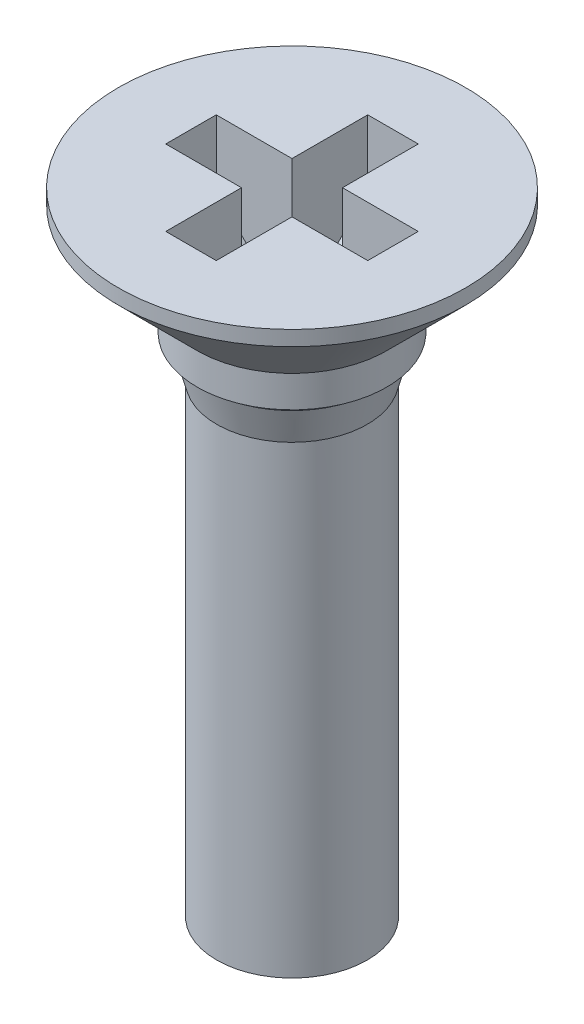
ISO-10303-21;
HEADER;
FILE_DESCRIPTION(('STEP AP214'),'2;1');
FILE_NAME('part.step','',(''),(''),'','','');
FILE_SCHEMA(('AUTOMOTIVE_DESIGN { 1 0 10303 214 1 1 1 1 }'));
ENDSEC;
DATA;
#1=APPLICATION_CONTEXT('core data for automotive mechanical design processes');
#2=APPLICATION_PROTOCOL_DEFINITION('international standard','automotive_design',2000,#1);
#3=PRODUCT_CONTEXT('',#1,'mechanical');
#4=PRODUCT('Part','Part','',(#3));
#5=PRODUCT_RELATED_PRODUCT_CATEGORY('part','',(#4));
#6=PRODUCT_DEFINITION_FORMATION('','',#4);
#7=PRODUCT_DEFINITION_CONTEXT('part definition',#1,'design');
#8=PRODUCT_DEFINITION('design','',#6,#7);
#9=PRODUCT_DEFINITION_SHAPE('','',#8);
#10=(LENGTH_UNIT() NAMED_UNIT(*) SI_UNIT(.MILLI.,.METRE.));
#11=(NAMED_UNIT(*) PLANE_ANGLE_UNIT() SI_UNIT($,.RADIAN.));
#12=(NAMED_UNIT(*) SI_UNIT($,.STERADIAN.) SOLID_ANGLE_UNIT());
#13=UNCERTAINTY_MEASURE_WITH_UNIT(LENGTH_MEASURE(1.E-05),#10,'distance_accuracy_value','');
#14=(GEOMETRIC_REPRESENTATION_CONTEXT(3) GLOBAL_UNCERTAINTY_ASSIGNED_CONTEXT((#13)) GLOBAL_UNIT_ASSIGNED_CONTEXT((#10,
#11,#12)) REPRESENTATION_CONTEXT('',''));
#15=CARTESIAN_POINT('',(0.,0.,0.));
#16=DIRECTION('',(0.,0.,1.));
#17=DIRECTION('',(1.,0.,0.));
#18=AXIS2_PLACEMENT_3D('',#15,#16,#17);
#19=CARTESIAN_POINT('',(0.,-2.65,-0.4));
#20=DIRECTION('',(0.,0.,-1.));
#21=DIRECTION('',(-1.,0.,0.));
#22=AXIS2_PLACEMENT_3D('',#19,#20,#21);
#23=PLANE('',#22);
#24=DIRECTION('',(0.,1.,0.));
#25=VECTOR('',#24,1.);
#26=CARTESIAN_POINT('',(0.4,-2.65,-0.4));
#27=LINE('',#26,#25);
#28=CARTESIAN_POINT('',(0.4,-2.1,-0.4));
#29=VERTEX_POINT('',#28);
#30=CARTESIAN_POINT('',(0.4,0.,-0.4));
#31=VERTEX_POINT('',#30);
#32=EDGE_CURVE('E203',#29,#31,#27,.T.);
#33=ORIENTED_EDGE('',*,*,#32,.F.);
#34=DIRECTION('',(1.,0.,0.));
#35=VECTOR('',#34,1.);
#36=CARTESIAN_POINT('',(-0.550000000000002,-2.1,-0.4));
#37=LINE('',#36,#35);
#38=CARTESIAN_POINT('',(0.550000000000002,-2.1,-0.4));
#39=VERTEX_POINT('',#38);
#40=EDGE_CURVE('E238',#29,#39,#37,.T.);
#41=ORIENTED_EDGE('',*,*,#40,.T.);
#42=DIRECTION('',(0.707106781186546,0.707106781186548,0.));
#43=VECTOR('',#42,1.);
#44=CARTESIAN_POINT('',(1.6,-1.05,-0.4));
#45=LINE('',#44,#43);
#46=CARTESIAN_POINT('',(1.6,-1.05,-0.4));
#47=VERTEX_POINT('',#46);
#48=EDGE_CURVE('E242',#39,#47,#45,.T.);
#49=ORIENTED_EDGE('',*,*,#48,.T.);
#50=DIRECTION('',(0.,1.,0.));
#51=VECTOR('',#50,1.);
#52=CARTESIAN_POINT('',(1.6,0.,-0.4));
#53=LINE('',#52,#51);
#54=CARTESIAN_POINT('',(1.6,0.,-0.4));
#55=VERTEX_POINT('',#54);
#56=EDGE_CURVE('E245',#47,#55,#53,.T.);
#57=ORIENTED_EDGE('',*,*,#56,.T.);
#58=DIRECTION('',(-1.,0.,0.));
#59=VECTOR('',#58,1.);
#60=CARTESIAN_POINT('',(1.6,0.,-0.4));
#61=LINE('',#60,#59);
#62=EDGE_CURVE('E249',#55,#31,#61,.T.);
#63=ORIENTED_EDGE('',*,*,#62,.T.);
#64=EDGE_LOOP('',(#33,#41,#49,#57,#63));
#65=FACE_BOUND('',#64,.T.);
#66=ADVANCED_FACE('F38',(#65),#23,.F.);
#67=CARTESIAN_POINT('',(0.,-2.65,0.4));
#68=DIRECTION('',(0.,0.,-1.));
#69=DIRECTION('',(-1.,0.,0.));
#70=AXIS2_PLACEMENT_3D('',#67,#68,#69);
#71=PLANE('',#70);
#72=DIRECTION('',(1.,0.,0.));
#73=VECTOR('',#72,1.);
#74=CARTESIAN_POINT('',(-0.550000000000002,-2.1,0.4));
#75=LINE('',#74,#73);
#76=CARTESIAN_POINT('',(0.4,-2.1,0.4));
#77=VERTEX_POINT('',#76);
#78=CARTESIAN_POINT('',(0.550000000000002,-2.1,0.4));
#79=VERTEX_POINT('',#78);
#80=EDGE_CURVE('E220',#77,#79,#75,.T.);
#81=ORIENTED_EDGE('',*,*,#80,.F.);
#82=DIRECTION('',(0.,1.,0.));
#83=VECTOR('',#82,1.);
#84=CARTESIAN_POINT('',(0.4,-2.65,0.4));
#85=LINE('',#84,#83);
#86=CARTESIAN_POINT('',(0.4,0.,0.4));
#87=VERTEX_POINT('',#86);
#88=EDGE_CURVE('E46',#77,#87,#85,.T.);
#89=ORIENTED_EDGE('',*,*,#88,.T.);
#90=DIRECTION('',(-1.,0.,0.));
#91=VECTOR('',#90,1.);
#92=CARTESIAN_POINT('',(1.6,0.,0.4));
#93=LINE('',#92,#91);
#94=CARTESIAN_POINT('',(1.6,0.,0.4));
#95=VERTEX_POINT('',#94);
#96=EDGE_CURVE('E229',#95,#87,#93,.T.);
#97=ORIENTED_EDGE('',*,*,#96,.F.);
#98=DIRECTION('',(0.,1.,0.));
#99=VECTOR('',#98,1.);
#100=CARTESIAN_POINT('',(1.6,0.,0.4));
#101=LINE('',#100,#99);
#102=CARTESIAN_POINT('',(1.6,-1.05,0.4));
#103=VERTEX_POINT('',#102);
#104=EDGE_CURVE('E226',#103,#95,#101,.T.);
#105=ORIENTED_EDGE('',*,*,#104,.F.);
#106=DIRECTION('',(0.707106781186546,0.707106781186548,0.));
#107=VECTOR('',#106,1.);
#108=CARTESIAN_POINT('',(1.6,-1.05,0.4));
#109=LINE('',#108,#107);
#110=EDGE_CURVE('E223',#79,#103,#109,.T.);
#111=ORIENTED_EDGE('',*,*,#110,.F.);
#112=EDGE_LOOP('',(#81,#89,#97,#105,#111));
#113=FACE_BOUND('',#112,.T.);
#114=ADVANCED_FACE('F292',(#113),#71,.T.);
#115=CARTESIAN_POINT('',(0.,0.,0.));
#116=DIRECTION('',(0.,-1.,0.));
#117=DIRECTION('',(1.,0.,0.));
#118=AXIS2_PLACEMENT_3D('',#115,#116,#117);
#119=PLANE('',#118);
#120=DIRECTION('',(1.,0.,0.));
#121=VECTOR('',#120,1.);
#122=CARTESIAN_POINT('',(-0.4,0.,1.6));
#123=LINE('',#122,#121);
#124=CARTESIAN_POINT('',(-0.4,0.,1.6));
#125=VERTEX_POINT('',#124);
#126=CARTESIAN_POINT('',(0.4,0.,1.6));
#127=VERTEX_POINT('',#126);
#128=EDGE_CURVE('E204',#125,#127,#123,.T.);
#129=ORIENTED_EDGE('',*,*,#128,.F.);
#130=DIRECTION('',(0.,0.,1.));
#131=VECTOR('',#130,1.);
#132=CARTESIAN_POINT('',(-0.4,0.,-1.6));
#133=LINE('',#132,#131);
#134=CARTESIAN_POINT('',(-0.4,0.,0.399999999999999));
#135=VERTEX_POINT('',#134);
#136=EDGE_CURVE('E197',#135,#125,#133,.T.);
#137=ORIENTED_EDGE('',*,*,#136,.F.);
#138=CARTESIAN_POINT('',(-1.6,0.,0.4));
#139=VERTEX_POINT('',#138);
#140=EDGE_CURVE('E228',#135,#139,#93,.T.);
#141=ORIENTED_EDGE('',*,*,#140,.T.);
#142=DIRECTION('',(0.,0.,1.));
#143=VECTOR('',#142,1.);
#144=CARTESIAN_POINT('',(-1.6,0.,-0.4));
#145=LINE('',#144,#143);
#146=CARTESIAN_POINT('',(-1.6,0.,-0.4));
#147=VERTEX_POINT('',#146);
#148=EDGE_CURVE('E259',#147,#139,#145,.T.);
#149=ORIENTED_EDGE('',*,*,#148,.F.);
#150=CARTESIAN_POINT('',(-0.4,0.,-0.4));
#151=VERTEX_POINT('',#150);
#152=EDGE_CURVE('E248',#151,#147,#61,.T.);
#153=ORIENTED_EDGE('',*,*,#152,.F.);
#154=CARTESIAN_POINT('',(-0.4,0.,-1.6));
#155=VERTEX_POINT('',#154);
#156=EDGE_CURVE('E198',#155,#151,#133,.T.);
#157=ORIENTED_EDGE('',*,*,#156,.F.);
#158=DIRECTION('',(1.,0.,0.));
#159=VECTOR('',#158,1.);
#160=CARTESIAN_POINT('',(-0.4,0.,-1.6));
#161=LINE('',#160,#159);
#162=CARTESIAN_POINT('',(0.4,0.,-1.6));
#163=VERTEX_POINT('',#162);
#164=EDGE_CURVE('E206',#155,#163,#161,.T.);
#165=ORIENTED_EDGE('',*,*,#164,.T.);
#166=DIRECTION('',(0.,0.,1.));
#167=VECTOR('',#166,1.);
#168=CARTESIAN_POINT('',(0.4,0.,-1.6));
#169=LINE('',#168,#167);
#170=EDGE_CURVE('E182',#163,#31,#169,.T.);
#171=ORIENTED_EDGE('',*,*,#170,.T.);
#172=ORIENTED_EDGE('',*,*,#62,.F.);
#173=DIRECTION('',(0.,0.,1.));
#174=VECTOR('',#173,1.);
#175=CARTESIAN_POINT('',(1.6,0.,-0.4));
#176=LINE('',#175,#174);
#177=EDGE_CURVE('E262',#55,#95,#176,.T.);
#178=ORIENTED_EDGE('',*,*,#177,.T.);
#179=ORIENTED_EDGE('',*,*,#96,.T.);
#180=EDGE_CURVE('E61',#87,#127,#169,.T.);
#181=ORIENTED_EDGE('',*,*,#180,.T.);
#182=EDGE_LOOP('',(#129,#137,#141,#149,#153,#157,#165,#171,#172,#178,#179,#181));
#183=FACE_BOUND('',#182,.T.);
#184=CARTESIAN_POINT('',(0.,0.,0.));
#185=DIRECTION('',(0.,1.,0.));
#186=DIRECTION('',(-1.,0.,0.));
#187=AXIS2_PLACEMENT_3D('',#184,#185,#186);
#188=CIRCLE('',#187,2.75);
#189=CARTESIAN_POINT('',(-2.75,0.,0.));
#190=VERTEX_POINT('',#189);
#191=EDGE_CURVE('E288',#190,#190,#188,.T.);
#192=ORIENTED_EDGE('',*,*,#191,.T.);
#193=EDGE_LOOP('',(#192));
#194=FACE_BOUND('',#193,.T.);
#195=ADVANCED_FACE('F40',(#183,#194),#119,.F.);
#196=CARTESIAN_POINT('',(0.,0.,0.));
#197=DIRECTION('',(0.,1.,0.));
#198=DIRECTION('',(-1.,0.,0.));
#199=AXIS2_PLACEMENT_3D('',#196,#197,#198);
#200=CYLINDRICAL_SURFACE('',#199,2.75);
#201=ORIENTED_EDGE('',*,*,#191,.F.);
#202=EDGE_LOOP('',(#201));
#203=FACE_BOUND('',#202,.T.);
#204=CARTESIAN_POINT('',(0.,-0.237500000000007,0.));
#205=DIRECTION('',(0.,1.,0.));
#206=DIRECTION('',(-1.,0.,0.));
#207=AXIS2_PLACEMENT_3D('',#204,#205,#206);
#208=CIRCLE('',#207,2.75);
#209=CARTESIAN_POINT('',(-2.75,-0.237500000000007,0.));
#210=VERTEX_POINT('',#209);
#211=EDGE_CURVE('E285',#210,#210,#208,.T.);
#212=ORIENTED_EDGE('',*,*,#211,.T.);
#213=EDGE_LOOP('',(#212));
#214=FACE_BOUND('',#213,.T.);
#215=ADVANCED_FACE('F397',(#203,#214),#200,.T.);
#216=CARTESIAN_POINT('',(0.,-1.4875,0.));
#217=DIRECTION('',(0.,1.,0.));
#218=DIRECTION('',(-1.,0.,0.));
#219=AXIS2_PLACEMENT_3D('',#216,#217,#218);
#220=CONICAL_SURFACE('',#219,1.5,0.78539816339745);
#221=ORIENTED_EDGE('',*,*,#211,.F.);
#222=EDGE_LOOP('',(#221));
#223=FACE_BOUND('',#222,.T.);
#224=CARTESIAN_POINT('',(0.,-1.4875,0.));
#225=DIRECTION('',(0.,1.,0.));
#226=DIRECTION('',(-1.,0.,0.));
#227=AXIS2_PLACEMENT_3D('',#224,#225,#226);
#228=CIRCLE('',#227,1.5);
#229=CARTESIAN_POINT('',(-1.5,-1.4875,0.));
#230=VERTEX_POINT('',#229);
#231=EDGE_CURVE('E282',#230,#230,#228,.T.);
#232=ORIENTED_EDGE('',*,*,#231,.T.);
#233=EDGE_LOOP('',(#232));
#234=FACE_BOUND('',#233,.T.);
#235=ADVANCED_FACE('F394',(#223,#234),#220,.T.);
#236=CARTESIAN_POINT('',(0.,0.,0.));
#237=DIRECTION('',(0.,1.,0.));
#238=DIRECTION('',(-1.,0.,0.));
#239=AXIS2_PLACEMENT_3D('',#236,#237,#238);
#240=CYLINDRICAL_SURFACE('',#239,1.5);
#241=ORIENTED_EDGE('',*,*,#231,.F.);
#242=EDGE_LOOP('',(#241));
#243=FACE_BOUND('',#242,.T.);
#244=CARTESIAN_POINT('',(0.,-1.9875,0.));
#245=DIRECTION('',(0.,1.,0.));
#246=DIRECTION('',(-1.,0.,0.));
#247=AXIS2_PLACEMENT_3D('',#244,#245,#246);
#248=CIRCLE('',#247,1.5);
#249=CARTESIAN_POINT('',(-1.5,-1.9875,0.));
#250=VERTEX_POINT('',#249);
#251=EDGE_CURVE('E279',#250,#250,#248,.T.);
#252=ORIENTED_EDGE('',*,*,#251,.T.);
#253=EDGE_LOOP('',(#252));
#254=FACE_BOUND('',#253,.T.);
#255=ADVANCED_FACE('F390',(#243,#254),#240,.T.);
#256=CARTESIAN_POINT('',(1.5,-1.9875,0.));
#257=DIRECTION('',(0.,1.,0.));
#258=DIRECTION('',(-1.,0.,0.));
#259=AXIS2_PLACEMENT_3D('',#256,#257,#258);
#260=PLANE('',#259);
#261=ORIENTED_EDGE('',*,*,#251,.F.);
#262=EDGE_LOOP('',(#261));
#263=FACE_BOUND('',#262,.T.);
#264=CARTESIAN_POINT('',(0.,-1.9875,0.));
#265=DIRECTION('',(0.,1.,0.));
#266=DIRECTION('',(-1.,0.,0.));
#267=AXIS2_PLACEMENT_3D('',#264,#265,#266);
#268=CIRCLE('',#267,1.3375);
#269=CARTESIAN_POINT('',(-1.3375,-1.9875,0.));
#270=VERTEX_POINT('',#269);
#271=EDGE_CURVE('E276',#270,#270,#268,.T.);
#272=ORIENTED_EDGE('',*,*,#271,.T.);
#273=EDGE_LOOP('',(#272));
#274=FACE_BOUND('',#273,.T.);
#275=ADVANCED_FACE('F386',(#263,#274),#260,.F.);
#276=CARTESIAN_POINT('',(0.,0.,0.));
#277=DIRECTION('',(0.,1.,0.));
#278=DIRECTION('',(-1.,0.,0.));
#279=AXIS2_PLACEMENT_3D('',#276,#277,#278);
#280=CYLINDRICAL_SURFACE('',#279,1.3375);
#281=ORIENTED_EDGE('',*,*,#271,.F.);
#282=EDGE_LOOP('',(#281));
#283=FACE_BOUND('',#282,.T.);
#284=CARTESIAN_POINT('',(0.,-2.11258468371008,0.));
#285=DIRECTION('',(0.,1.,0.));
#286=DIRECTION('',(-1.,0.,0.));
#287=AXIS2_PLACEMENT_3D('',#284,#285,#286);
#288=CIRCLE('',#287,1.3375);
#289=CARTESIAN_POINT('',(-1.3375,-2.11258468371008,0.));
#290=VERTEX_POINT('',#289);
#291=EDGE_CURVE('E273',#290,#290,#288,.T.);
#292=ORIENTED_EDGE('',*,*,#291,.T.);
#293=EDGE_LOOP('',(#292));
#294=FACE_BOUND('',#293,.T.);
#295=ADVANCED_FACE('F382',(#283,#294),#280,.T.);
#296=CARTESIAN_POINT('',(0.,-2.65,0.));
#297=DIRECTION('',(0.,1.,0.));
#298=DIRECTION('',(-1.,0.,0.));
#299=AXIS2_PLACEMENT_3D('',#296,#297,#298);
#300=CONICAL_SURFACE('',#299,1.1935,0.26179938779915);
#301=ORIENTED_EDGE('',*,*,#291,.F.);
#302=EDGE_LOOP('',(#301));
#303=FACE_BOUND('',#302,.T.);
#304=CARTESIAN_POINT('',(0.,-2.65,0.));
#305=DIRECTION('',(0.,1.,0.));
#306=DIRECTION('',(-1.,0.,0.));
#307=AXIS2_PLACEMENT_3D('',#304,#305,#306);
#308=CIRCLE('',#307,1.1935);
#309=CARTESIAN_POINT('',(-1.1935,-2.65,0.));
#310=VERTEX_POINT('',#309);
#311=EDGE_CURVE('E258',#310,#310,#308,.T.);
#312=ORIENTED_EDGE('',*,*,#311,.T.);
#313=EDGE_LOOP('',(#312));
#314=FACE_BOUND('',#313,.T.);
#315=ADVANCED_FACE('F378',(#303,#314),#300,.T.);
#316=CARTESIAN_POINT('',(0.,0.,0.));
#317=DIRECTION('',(0.,1.,0.));
#318=DIRECTION('',(-1.,0.,0.));
#319=AXIS2_PLACEMENT_3D('',#316,#317,#318);
#320=CYLINDRICAL_SURFACE('',#319,1.1935);
#321=ORIENTED_EDGE('',*,*,#311,.F.);
#322=EDGE_LOOP('',(#321));
#323=FACE_BOUND('',#322,.T.);
#324=CARTESIAN_POINT('',(0.,-10.,0.));
#325=DIRECTION('',(0.,-1.,0.));
#326=DIRECTION('',(1.,0.,0.));
#327=AXIS2_PLACEMENT_3D('',#324,#325,#326);
#328=CIRCLE('',#327,1.1935);
#329=CARTESIAN_POINT('',(1.1935,-10.,0.));
#330=VERTEX_POINT('',#329);
#331=EDGE_CURVE('E173',#330,#330,#328,.T.);
#332=ORIENTED_EDGE('',*,*,#331,.F.);
#333=EDGE_LOOP('',(#332));
#334=FACE_BOUND('',#333,.T.);
#335=ADVANCED_FACE('F375',(#323,#334),#320,.T.);
#336=CARTESIAN_POINT('',(-1.6,-1.05,-0.4));
#337=DIRECTION('',(-0.707106781186548,-0.707106781186546,0.));
#338=DIRECTION('',(0.707106781186547,-0.707106781186548,0.));
#339=AXIS2_PLACEMENT_3D('',#336,#337,#338);
#340=PLANE('',#339);
#341=DIRECTION('',(0.,0.,1.));
#342=VECTOR('',#341,1.);
#343=CARTESIAN_POINT('',(-0.550000000000002,-2.1,-0.4));
#344=LINE('',#343,#342);
#345=CARTESIAN_POINT('',(-0.550000000000002,-2.1,-0.4));
#346=VERTEX_POINT('',#345);
#347=CARTESIAN_POINT('',(-0.550000000000002,-2.1,0.4));
#348=VERTEX_POINT('',#347);
#349=EDGE_CURVE('E255',#346,#348,#344,.T.);
#350=ORIENTED_EDGE('',*,*,#349,.F.);
#351=DIRECTION('',(0.707106781186546,-0.707106781186548,0.));
#352=VECTOR('',#351,1.);
#353=CARTESIAN_POINT('',(-1.6,-1.05,-0.4));
#354=LINE('',#353,#352);
#355=CARTESIAN_POINT('',(-1.6,-1.05,-0.4));
#356=VERTEX_POINT('',#355);
#357=EDGE_CURVE('E235',#356,#346,#354,.T.);
#358=ORIENTED_EDGE('',*,*,#357,.F.);
#359=DIRECTION('',(0.,0.,1.));
#360=VECTOR('',#359,1.);
#361=CARTESIAN_POINT('',(-1.6,-1.05,-0.4));
#362=LINE('',#361,#360);
#363=CARTESIAN_POINT('',(-1.6,-1.05,0.4));
#364=VERTEX_POINT('',#363);
#365=EDGE_CURVE('E256',#356,#364,#362,.T.);
#366=ORIENTED_EDGE('',*,*,#365,.T.);
#367=DIRECTION('',(0.707106781186546,-0.707106781186548,0.));
#368=VECTOR('',#367,1.);
#369=CARTESIAN_POINT('',(-1.6,-1.05,0.4));
#370=LINE('',#369,#368);
#371=EDGE_CURVE('E217',#364,#348,#370,.T.);
#372=ORIENTED_EDGE('',*,*,#371,.T.);
#373=EDGE_LOOP('',(#350,#358,#366,#372));
#374=FACE_BOUND('',#373,.T.);
#375=ADVANCED_FACE('F329',(#374),#340,.F.);
#376=CARTESIAN_POINT('',(-1.6,0.,-0.4));
#377=DIRECTION('',(-1.,0.,0.));
#378=DIRECTION('',(0.,0.,1.));
#379=AXIS2_PLACEMENT_3D('',#376,#377,#378);
#380=PLANE('',#379);
#381=ORIENTED_EDGE('',*,*,#365,.F.);
#382=DIRECTION('',(0.,-1.,0.));
#383=VECTOR('',#382,1.);
#384=CARTESIAN_POINT('',(-1.6,0.,-0.4));
#385=LINE('',#384,#383);
#386=EDGE_CURVE('E252',#147,#356,#385,.T.);
#387=ORIENTED_EDGE('',*,*,#386,.F.);
#388=ORIENTED_EDGE('',*,*,#148,.T.);
#389=DIRECTION('',(0.,-1.,0.));
#390=VECTOR('',#389,1.);
#391=CARTESIAN_POINT('',(-1.6,0.,0.4));
#392=LINE('',#391,#390);
#393=EDGE_CURVE('E232',#139,#364,#392,.T.);
#394=ORIENTED_EDGE('',*,*,#393,.T.);
#395=EDGE_LOOP('',(#381,#387,#388,#394));
#396=FACE_BOUND('',#395,.T.);
#397=ADVANCED_FACE('F374',(#396),#380,.F.);
#398=CARTESIAN_POINT('',(1.6,0.,-0.4));
#399=DIRECTION('',(1.,0.,0.));
#400=DIRECTION('',(0.,0.,-1.));
#401=AXIS2_PLACEMENT_3D('',#398,#399,#400);
#402=PLANE('',#401);
#403=ORIENTED_EDGE('',*,*,#177,.F.);
#404=ORIENTED_EDGE('',*,*,#56,.F.);
#405=DIRECTION('',(0.,0.,1.));
#406=VECTOR('',#405,1.);
#407=CARTESIAN_POINT('',(1.6,-1.05,-0.4));
#408=LINE('',#407,#406);
#409=EDGE_CURVE('E265',#47,#103,#408,.T.);
#410=ORIENTED_EDGE('',*,*,#409,.T.);
#411=ORIENTED_EDGE('',*,*,#104,.T.);
#412=EDGE_LOOP('',(#403,#404,#410,#411));
#413=FACE_BOUND('',#412,.T.);
#414=ADVANCED_FACE('F301',(#413),#402,.F.);
#415=CARTESIAN_POINT('',(1.6,-1.05,-0.4));
#416=DIRECTION('',(0.707106781186548,-0.707106781186546,0.));
#417=DIRECTION('',(0.707106781186547,0.707106781186548,0.));
#418=AXIS2_PLACEMENT_3D('',#415,#416,#417);
#419=PLANE('',#418);
#420=ORIENTED_EDGE('',*,*,#409,.F.);
#421=ORIENTED_EDGE('',*,*,#48,.F.);
#422=DIRECTION('',(0.,0.,1.));
#423=VECTOR('',#422,1.);
#424=CARTESIAN_POINT('',(0.550000000000002,-2.1,-0.4));
#425=LINE('',#424,#423);
#426=EDGE_CURVE('E267',#39,#79,#425,.T.);
#427=ORIENTED_EDGE('',*,*,#426,.T.);
#428=ORIENTED_EDGE('',*,*,#110,.T.);
#429=EDGE_LOOP('',(#420,#421,#427,#428));
#430=FACE_BOUND('',#429,.T.);
#431=ADVANCED_FACE('F307',(#430),#419,.F.);
#432=CARTESIAN_POINT('',(-0.550000000000002,-2.1,-0.4));
#433=DIRECTION('',(0.,-1.,0.));
#434=DIRECTION('',(0.,0.,-1.));
#435=AXIS2_PLACEMENT_3D('',#432,#433,#434);
#436=PLANE('',#435);
#437=CARTESIAN_POINT('',(-0.4,-2.1,0.4));
#438=VERTEX_POINT('',#437);
#439=EDGE_CURVE('E221',#348,#438,#75,.T.);
#440=ORIENTED_EDGE('',*,*,#439,.T.);
#441=DIRECTION('',(0.,0.,-1.));
#442=VECTOR('',#441,1.);
#443=CARTESIAN_POINT('',(-0.4,-2.1,0.550000000000002));
#444=LINE('',#443,#442);
#445=CARTESIAN_POINT('',(-0.4,-2.1,0.550000000000002));
#446=VERTEX_POINT('',#445);
#447=EDGE_CURVE('E157',#446,#438,#444,.T.);
#448=ORIENTED_EDGE('',*,*,#447,.F.);
#449=DIRECTION('',(1.,0.,0.));
#450=VECTOR('',#449,1.);
#451=CARTESIAN_POINT('',(-0.4,-2.1,0.550000000000002));
#452=LINE('',#451,#450);
#453=CARTESIAN_POINT('',(0.4,-2.1,0.550000000000002));
#454=VERTEX_POINT('',#453);
#455=EDGE_CURVE('E151',#446,#454,#452,.T.);
#456=ORIENTED_EDGE('',*,*,#455,.T.);
#457=DIRECTION('',(0.,0.,-1.));
#458=VECTOR('',#457,1.);
#459=CARTESIAN_POINT('',(0.4,-2.1,0.550000000000002));
#460=LINE('',#459,#458);
#461=EDGE_CURVE('E155',#454,#77,#460,.T.);
#462=ORIENTED_EDGE('',*,*,#461,.T.);
#463=ORIENTED_EDGE('',*,*,#80,.T.);
#464=ORIENTED_EDGE('',*,*,#426,.F.);
#465=ORIENTED_EDGE('',*,*,#40,.F.);
#466=CARTESIAN_POINT('',(0.4,-2.1,-0.550000000000002));
#467=VERTEX_POINT('',#466);
#468=EDGE_CURVE('E53',#29,#467,#460,.T.);
#469=ORIENTED_EDGE('',*,*,#468,.T.);
#470=DIRECTION('',(1.,0.,0.));
#471=VECTOR('',#470,1.);
#472=CARTESIAN_POINT('',(-0.4,-2.1,-0.550000000000002));
#473=LINE('',#472,#471);
#474=CARTESIAN_POINT('',(-0.4,-2.1,-0.550000000000002));
#475=VERTEX_POINT('',#474);
#476=EDGE_CURVE('E162',#475,#467,#473,.T.);
#477=ORIENTED_EDGE('',*,*,#476,.F.);
#478=CARTESIAN_POINT('',(-0.4,-2.1,-0.4));
#479=VERTEX_POINT('',#478);
#480=EDGE_CURVE('E189',#479,#475,#444,.T.);
#481=ORIENTED_EDGE('',*,*,#480,.F.);
#482=EDGE_CURVE('E239',#346,#479,#37,.T.);
#483=ORIENTED_EDGE('',*,*,#482,.F.);
#484=ORIENTED_EDGE('',*,*,#349,.T.);
#485=EDGE_LOOP('',(#440,#448,#456,#462,#463,#464,#465,#469,#477,#481,#483,#484));
#486=FACE_BOUND('',#485,.T.);
#487=ADVANCED_FACE('F154',(#486),#436,.F.);
#488=ORIENTED_EDGE('',*,*,#482,.T.);
#489=DIRECTION('',(0.,1.,0.));
#490=VECTOR('',#489,1.);
#491=CARTESIAN_POINT('',(-0.4,-2.65,-0.4));
#492=LINE('',#491,#490);
#493=EDGE_CURVE('E214',#479,#151,#492,.T.);
#494=ORIENTED_EDGE('',*,*,#493,.T.);
#495=ORIENTED_EDGE('',*,*,#152,.T.);
#496=ORIENTED_EDGE('',*,*,#386,.T.);
#497=ORIENTED_EDGE('',*,*,#357,.T.);
#498=EDGE_LOOP('',(#488,#494,#495,#496,#497));
#499=FACE_BOUND('',#498,.T.);
#500=ADVANCED_FACE('F324',(#499),#23,.F.);
#501=DIRECTION('',(0.,1.,0.));
#502=VECTOR('',#501,1.);
#503=CARTESIAN_POINT('',(-0.4,-2.65,0.4));
#504=LINE('',#503,#502);
#505=EDGE_CURVE('E11',#438,#135,#504,.T.);
#506=ORIENTED_EDGE('',*,*,#505,.F.);
#507=ORIENTED_EDGE('',*,*,#439,.F.);
#508=ORIENTED_EDGE('',*,*,#371,.F.);
#509=ORIENTED_EDGE('',*,*,#393,.F.);
#510=ORIENTED_EDGE('',*,*,#140,.F.);
#511=EDGE_LOOP('',(#506,#507,#508,#509,#510));
#512=FACE_BOUND('',#511,.T.);
#513=ADVANCED_FACE('F334',(#512),#71,.T.);
#514=CARTESIAN_POINT('',(-0.4,-1.05,1.6));
#515=DIRECTION('',(0.,-0.707106781186546,0.707106781186548));
#516=DIRECTION('',(0.,-0.707106781186548,-0.707106781186547));
#517=AXIS2_PLACEMENT_3D('',#514,#515,#516);
#518=PLANE('',#517);
#519=ORIENTED_EDGE('',*,*,#455,.F.);
#520=DIRECTION('',(0.,-0.707106781186548,-0.707106781186546));
#521=VECTOR('',#520,1.);
#522=CARTESIAN_POINT('',(-0.4,-1.05,1.6));
#523=LINE('',#522,#521);
#524=CARTESIAN_POINT('',(-0.4,-1.05,1.6));
#525=VERTEX_POINT('',#524);
#526=EDGE_CURVE('E187',#525,#446,#523,.T.);
#527=ORIENTED_EDGE('',*,*,#526,.F.);
#528=DIRECTION('',(1.,0.,0.));
#529=VECTOR('',#528,1.);
#530=CARTESIAN_POINT('',(-0.4,-1.05,1.6));
#531=LINE('',#530,#529);
#532=CARTESIAN_POINT('',(0.4,-1.05,1.6));
#533=VERTEX_POINT('',#532);
#534=EDGE_CURVE('E171',#525,#533,#531,.T.);
#535=ORIENTED_EDGE('',*,*,#534,.T.);
#536=DIRECTION('',(0.,-0.707106781186548,-0.707106781186546));
#537=VECTOR('',#536,1.);
#538=CARTESIAN_POINT('',(0.4,-1.05,1.6));
#539=LINE('',#538,#537);
#540=EDGE_CURVE('E167',#533,#454,#539,.T.);
#541=ORIENTED_EDGE('',*,*,#540,.T.);
#542=EDGE_LOOP('',(#519,#527,#535,#541));
#543=FACE_BOUND('',#542,.T.);
#544=ADVANCED_FACE('F170',(#543),#518,.F.);
#545=CARTESIAN_POINT('',(-0.4,-2.65,0.));
#546=DIRECTION('',(-1.,0.,0.));
#547=DIRECTION('',(0.,0.,1.));
#548=AXIS2_PLACEMENT_3D('',#545,#546,#547);
#549=PLANE('',#548);
#550=ORIENTED_EDGE('',*,*,#505,.T.);
#551=ORIENTED_EDGE('',*,*,#136,.T.);
#552=DIRECTION('',(0.,-1.,0.));
#553=VECTOR('',#552,1.);
#554=CARTESIAN_POINT('',(-0.4,0.,1.6));
#555=LINE('',#554,#553);
#556=EDGE_CURVE('E163',#125,#525,#555,.T.);
#557=ORIENTED_EDGE('',*,*,#556,.T.);
#558=ORIENTED_EDGE('',*,*,#526,.T.);
#559=ORIENTED_EDGE('',*,*,#447,.T.);
#560=EDGE_LOOP('',(#550,#551,#557,#558,#559));
#561=FACE_BOUND('',#560,.T.);
#562=ADVANCED_FACE('F339',(#561),#549,.F.);
#563=CARTESIAN_POINT('',(0.4,-2.65,0.));
#564=DIRECTION('',(-1.,0.,0.));
#565=DIRECTION('',(0.,0.,1.));
#566=AXIS2_PLACEMENT_3D('',#563,#564,#565);
#567=PLANE('',#566);
#568=ORIENTED_EDGE('',*,*,#461,.F.);
#569=ORIENTED_EDGE('',*,*,#540,.F.);
#570=DIRECTION('',(0.,-1.,0.));
#571=VECTOR('',#570,1.);
#572=CARTESIAN_POINT('',(0.4,0.,1.6));
#573=LINE('',#572,#571);
#574=EDGE_CURVE('E185',#127,#533,#573,.T.);
#575=ORIENTED_EDGE('',*,*,#574,.F.);
#576=ORIENTED_EDGE('',*,*,#180,.F.);
#577=ORIENTED_EDGE('',*,*,#88,.F.);
#578=EDGE_LOOP('',(#568,#569,#575,#576,#577));
#579=FACE_BOUND('',#578,.T.);
#580=ADVANCED_FACE('F166',(#579),#567,.T.);
#581=CARTESIAN_POINT('',(-0.4,0.,1.6));
#582=DIRECTION('',(0.,0.,1.));
#583=DIRECTION('',(1.,0.,0.));
#584=AXIS2_PLACEMENT_3D('',#581,#582,#583);
#585=PLANE('',#584);
#586=ORIENTED_EDGE('',*,*,#534,.F.);
#587=ORIENTED_EDGE('',*,*,#556,.F.);
#588=ORIENTED_EDGE('',*,*,#128,.T.);
#589=ORIENTED_EDGE('',*,*,#574,.T.);
#590=EDGE_LOOP('',(#586,#587,#588,#589));
#591=FACE_BOUND('',#590,.T.);
#592=ADVANCED_FACE('F343',(#591),#585,.F.);
#593=ORIENTED_EDGE('',*,*,#480,.T.);
#594=DIRECTION('',(0.,0.707106781186548,-0.707106781186546));
#595=VECTOR('',#594,1.);
#596=CARTESIAN_POINT('',(-0.4,-1.05,-1.6));
#597=LINE('',#596,#595);
#598=CARTESIAN_POINT('',(-0.4,-1.05,-1.6));
#599=VERTEX_POINT('',#598);
#600=EDGE_CURVE('E191',#475,#599,#597,.T.);
#601=ORIENTED_EDGE('',*,*,#600,.T.);
#602=DIRECTION('',(0.,1.,0.));
#603=VECTOR('',#602,1.);
#604=CARTESIAN_POINT('',(-0.4,0.,-1.6));
#605=LINE('',#604,#603);
#606=EDGE_CURVE('E194',#599,#155,#605,.T.);
#607=ORIENTED_EDGE('',*,*,#606,.T.);
#608=ORIENTED_EDGE('',*,*,#156,.T.);
#609=ORIENTED_EDGE('',*,*,#493,.F.);
#610=EDGE_LOOP('',(#593,#601,#607,#608,#609));
#611=FACE_BOUND('',#610,.T.);
#612=ADVANCED_FACE('F321',(#611),#549,.F.);
#613=ORIENTED_EDGE('',*,*,#32,.T.);
#614=ORIENTED_EDGE('',*,*,#170,.F.);
#615=DIRECTION('',(0.,1.,0.));
#616=VECTOR('',#615,1.);
#617=CARTESIAN_POINT('',(0.4,0.,-1.6));
#618=LINE('',#617,#616);
#619=CARTESIAN_POINT('',(0.4,-1.05,-1.6));
#620=VERTEX_POINT('',#619);
#621=EDGE_CURVE('E180',#620,#163,#618,.T.);
#622=ORIENTED_EDGE('',*,*,#621,.F.);
#623=DIRECTION('',(0.,0.707106781186548,-0.707106781186546));
#624=VECTOR('',#623,1.);
#625=CARTESIAN_POINT('',(0.4,-1.05,-1.6));
#626=LINE('',#625,#624);
#627=EDGE_CURVE('E168',#467,#620,#626,.T.);
#628=ORIENTED_EDGE('',*,*,#627,.F.);
#629=ORIENTED_EDGE('',*,*,#468,.F.);
#630=EDGE_LOOP('',(#613,#614,#622,#628,#629));
#631=FACE_BOUND('',#630,.T.);
#632=ADVANCED_FACE('F314',(#631),#567,.T.);
#633=CARTESIAN_POINT('',(-0.4,0.,-1.6));
#634=DIRECTION('',(0.,0.,-1.));
#635=DIRECTION('',(-1.,0.,0.));
#636=AXIS2_PLACEMENT_3D('',#633,#634,#635);
#637=PLANE('',#636);
#638=ORIENTED_EDGE('',*,*,#164,.F.);
#639=ORIENTED_EDGE('',*,*,#606,.F.);
#640=DIRECTION('',(1.,0.,0.));
#641=VECTOR('',#640,1.);
#642=CARTESIAN_POINT('',(-0.4,-1.05,-1.6));
#643=LINE('',#642,#641);
#644=EDGE_CURVE('E209',#599,#620,#643,.T.);
#645=ORIENTED_EDGE('',*,*,#644,.T.);
#646=ORIENTED_EDGE('',*,*,#621,.T.);
#647=EDGE_LOOP('',(#638,#639,#645,#646));
#648=FACE_BOUND('',#647,.T.);
#649=ADVANCED_FACE('F317',(#648),#637,.F.);
#650=CARTESIAN_POINT('',(-0.4,-1.05,-1.6));
#651=DIRECTION('',(0.,-0.707106781186546,-0.707106781186548));
#652=DIRECTION('',(0.,0.707106781186548,-0.707106781186547));
#653=AXIS2_PLACEMENT_3D('',#650,#651,#652);
#654=PLANE('',#653);
#655=ORIENTED_EDGE('',*,*,#644,.F.);
#656=ORIENTED_EDGE('',*,*,#600,.F.);
#657=ORIENTED_EDGE('',*,*,#476,.T.);
#658=ORIENTED_EDGE('',*,*,#627,.T.);
#659=EDGE_LOOP('',(#655,#656,#657,#658));
#660=FACE_BOUND('',#659,.T.);
#661=ADVANCED_FACE('F312',(#660),#654,.F.);
#662=CARTESIAN_POINT('',(0.,-10.,0.));
#663=DIRECTION('',(0.,-1.,0.));
#664=DIRECTION('',(1.,0.,0.));
#665=AXIS2_PLACEMENT_3D('',#662,#663,#664);
#666=PLANE('',#665);
#667=ORIENTED_EDGE('',*,*,#331,.T.);
#668=EDGE_LOOP('',(#667));
#669=FACE_BOUND('',#668,.T.);
#670=ADVANCED_FACE('F420',(#669),#666,.T.);
#671=CLOSED_SHELL('',(#66,#114,#195,#215,#235,#255,#275,#295,#315,#335,#375,#397,#414,#431,#487,
#500,#513,#544,#562,#580,#592,#612,#632,#649,#661,#670));
#672=MANIFOLD_SOLID_BREP('B2',#671);
#673=ADVANCED_BREP_SHAPE_REPRESENTATION('',(#18,#672),#14);
#674=SHAPE_DEFINITION_REPRESENTATION(#9,#673);
ENDSEC;
END-ISO-10303-21;
